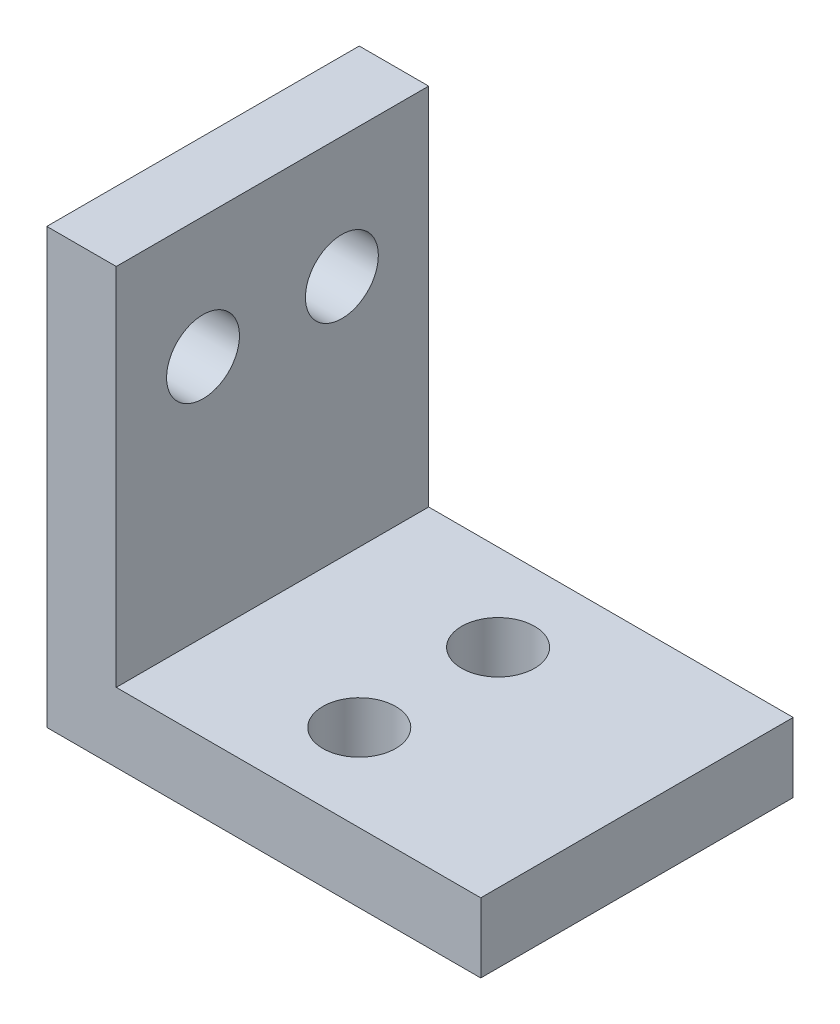
ISO-10303-21;
HEADER;
FILE_DESCRIPTION(('STEP AP214'),'2;1');
FILE_NAME('part.step','',(''),(''),'','','');
FILE_SCHEMA(('AUTOMOTIVE_DESIGN { 1 0 10303 214 1 1 1 1 }'));
ENDSEC;
DATA;
#1=APPLICATION_CONTEXT('core data for automotive mechanical design processes');
#2=APPLICATION_PROTOCOL_DEFINITION('international standard','automotive_design',2000,#1);
#3=PRODUCT_CONTEXT('',#1,'mechanical');
#4=PRODUCT('Part','Part','',(#3));
#5=PRODUCT_RELATED_PRODUCT_CATEGORY('part','',(#4));
#6=PRODUCT_DEFINITION_FORMATION('','',#4);
#7=PRODUCT_DEFINITION_CONTEXT('part definition',#1,'design');
#8=PRODUCT_DEFINITION('design','',#6,#7);
#9=PRODUCT_DEFINITION_SHAPE('','',#8);
#10=(LENGTH_UNIT() NAMED_UNIT(*) SI_UNIT(.MILLI.,.METRE.));
#11=(NAMED_UNIT(*) PLANE_ANGLE_UNIT() SI_UNIT($,.RADIAN.));
#12=(NAMED_UNIT(*) SI_UNIT($,.STERADIAN.) SOLID_ANGLE_UNIT());
#13=UNCERTAINTY_MEASURE_WITH_UNIT(LENGTH_MEASURE(1.E-05),#10,'distance_accuracy_value','');
#14=(GEOMETRIC_REPRESENTATION_CONTEXT(3) GLOBAL_UNCERTAINTY_ASSIGNED_CONTEXT((#13)) GLOBAL_UNIT_ASSIGNED_CONTEXT((#10,
#11,#12)) REPRESENTATION_CONTEXT('',''));
#15=CARTESIAN_POINT('',(0.,0.,0.));
#16=DIRECTION('',(0.,0.,1.));
#17=DIRECTION('',(1.,0.,0.));
#18=AXIS2_PLACEMENT_3D('',#15,#16,#17);
#19=CARTESIAN_POINT('',(4.,25.,18.));
#20=DIRECTION('',(0.,-1.,0.));
#21=DIRECTION('',(0.,0.,-1.));
#22=AXIS2_PLACEMENT_3D('',#19,#20,#21);
#23=PLANE('',#22);
#24=DIRECTION('',(-1.,0.,0.));
#25=VECTOR('',#24,1.);
#26=CARTESIAN_POINT('',(4.,25.,0.));
#27=LINE('',#26,#25);
#28=CARTESIAN_POINT('',(4.,25.,0.));
#29=VERTEX_POINT('',#28);
#30=CARTESIAN_POINT('',(0.,25.,0.));
#31=VERTEX_POINT('',#30);
#32=EDGE_CURVE('E119',#29,#31,#27,.T.);
#33=ORIENTED_EDGE('',*,*,#32,.T.);
#34=DIRECTION('',(0.,0.,-1.));
#35=VECTOR('',#34,1.);
#36=CARTESIAN_POINT('',(0.,25.,18.));
#37=LINE('',#36,#35);
#38=CARTESIAN_POINT('',(0.,25.,18.));
#39=VERTEX_POINT('',#38);
#40=EDGE_CURVE('E11',#39,#31,#37,.T.);
#41=ORIENTED_EDGE('',*,*,#40,.F.);
#42=DIRECTION('',(-1.,0.,0.));
#43=VECTOR('',#42,1.);
#44=CARTESIAN_POINT('',(4.,25.,18.));
#45=LINE('',#44,#43);
#46=CARTESIAN_POINT('',(4.,25.,18.));
#47=VERTEX_POINT('',#46);
#48=EDGE_CURVE('E130',#47,#39,#45,.T.);
#49=ORIENTED_EDGE('',*,*,#48,.F.);
#50=DIRECTION('',(0.,0.,-1.));
#51=VECTOR('',#50,1.);
#52=CARTESIAN_POINT('',(4.,25.,18.));
#53=LINE('',#52,#51);
#54=EDGE_CURVE('E115',#47,#29,#53,.T.);
#55=ORIENTED_EDGE('',*,*,#54,.T.);
#56=EDGE_LOOP('',(#33,#41,#49,#55));
#57=FACE_BOUND('',#56,.T.);
#58=ADVANCED_FACE('F33',(#57),#23,.F.);
#59=CARTESIAN_POINT('',(0.,25.,18.));
#60=DIRECTION('',(1.,0.,0.));
#61=DIRECTION('',(0.,1.,0.));
#62=AXIS2_PLACEMENT_3D('',#59,#60,#61);
#63=PLANE('',#62);
#64=CARTESIAN_POINT('',(0.,18.,13.));
#65=DIRECTION('',(-1.,0.,0.));
#66=DIRECTION('',(0.,-1.,0.));
#67=AXIS2_PLACEMENT_3D('',#64,#65,#66);
#68=CIRCLE('',#67,2.1);
#69=CARTESIAN_POINT('',(0.,15.9,13.));
#70=VERTEX_POINT('',#69);
#71=EDGE_CURVE('E137',#70,#70,#68,.T.);
#72=ORIENTED_EDGE('',*,*,#71,.F.);
#73=EDGE_LOOP('',(#72));
#74=FACE_BOUND('',#73,.T.);
#75=CARTESIAN_POINT('',(0.,18.,5.));
#76=DIRECTION('',(-1.,0.,0.));
#77=DIRECTION('',(0.,-1.,0.));
#78=AXIS2_PLACEMENT_3D('',#75,#76,#77);
#79=CIRCLE('',#78,2.1);
#80=CARTESIAN_POINT('',(0.,15.9,5.));
#81=VERTEX_POINT('',#80);
#82=EDGE_CURVE('E143',#81,#81,#79,.T.);
#83=ORIENTED_EDGE('',*,*,#82,.F.);
#84=EDGE_LOOP('',(#83));
#85=FACE_BOUND('',#84,.T.);
#86=DIRECTION('',(0.,-1.,0.));
#87=VECTOR('',#86,1.);
#88=CARTESIAN_POINT('',(0.,25.,0.));
#89=LINE('',#88,#87);
#90=CARTESIAN_POINT('',(0.,0.,0.));
#91=VERTEX_POINT('',#90);
#92=EDGE_CURVE('E122',#31,#91,#89,.T.);
#93=ORIENTED_EDGE('',*,*,#92,.T.);
#94=DIRECTION('',(0.,0.,-1.));
#95=VECTOR('',#94,1.);
#96=CARTESIAN_POINT('',(0.,0.,18.));
#97=LINE('',#96,#95);
#98=CARTESIAN_POINT('',(0.,0.,18.));
#99=VERTEX_POINT('',#98);
#100=EDGE_CURVE('E42',#99,#91,#97,.T.);
#101=ORIENTED_EDGE('',*,*,#100,.F.);
#102=DIRECTION('',(0.,-1.,0.));
#103=VECTOR('',#102,1.);
#104=CARTESIAN_POINT('',(0.,25.,18.));
#105=LINE('',#104,#103);
#106=EDGE_CURVE('E88',#39,#99,#105,.T.);
#107=ORIENTED_EDGE('',*,*,#106,.F.);
#108=ORIENTED_EDGE('',*,*,#40,.T.);
#109=EDGE_LOOP('',(#93,#101,#107,#108));
#110=FACE_BOUND('',#109,.T.);
#111=ADVANCED_FACE('F163',(#74,#85,#110),#63,.F.);
#112=CARTESIAN_POINT('',(0.,0.,18.));
#113=DIRECTION('',(0.,1.,0.));
#114=DIRECTION('',(0.,0.,1.));
#115=AXIS2_PLACEMENT_3D('',#112,#113,#114);
#116=PLANE('',#115);
#117=CARTESIAN_POINT('',(13.,0.,5.));
#118=DIRECTION('',(0.,1.,0.));
#119=DIRECTION('',(0.,0.,1.));
#120=AXIS2_PLACEMENT_3D('',#117,#118,#119);
#121=CIRCLE('',#120,2.1);
#122=CARTESIAN_POINT('',(13.,0.,7.1));
#123=VERTEX_POINT('',#122);
#124=EDGE_CURVE('E123',#123,#123,#121,.T.);
#125=ORIENTED_EDGE('',*,*,#124,.T.);
#126=EDGE_LOOP('',(#125));
#127=FACE_BOUND('',#126,.T.);
#128=CARTESIAN_POINT('',(13.,0.,13.));
#129=DIRECTION('',(0.,1.,0.));
#130=DIRECTION('',(0.,0.,1.));
#131=AXIS2_PLACEMENT_3D('',#128,#129,#130);
#132=CIRCLE('',#131,2.1);
#133=CARTESIAN_POINT('',(13.,0.,15.1));
#134=VERTEX_POINT('',#133);
#135=EDGE_CURVE('E153',#134,#134,#132,.T.);
#136=ORIENTED_EDGE('',*,*,#135,.T.);
#137=EDGE_LOOP('',(#136));
#138=FACE_BOUND('',#137,.T.);
#139=DIRECTION('',(1.,0.,0.));
#140=VECTOR('',#139,1.);
#141=CARTESIAN_POINT('',(0.,0.,0.));
#142=LINE('',#141,#140);
#143=CARTESIAN_POINT('',(25.,0.,0.));
#144=VERTEX_POINT('',#143);
#145=EDGE_CURVE('E125',#91,#144,#142,.T.);
#146=ORIENTED_EDGE('',*,*,#145,.T.);
#147=DIRECTION('',(0.,0.,-1.));
#148=VECTOR('',#147,1.);
#149=CARTESIAN_POINT('',(25.,0.,18.));
#150=LINE('',#149,#148);
#151=CARTESIAN_POINT('',(25.,0.,18.));
#152=VERTEX_POINT('',#151);
#153=EDGE_CURVE('E110',#152,#144,#150,.T.);
#154=ORIENTED_EDGE('',*,*,#153,.F.);
#155=DIRECTION('',(1.,0.,0.));
#156=VECTOR('',#155,1.);
#157=CARTESIAN_POINT('',(0.,0.,18.));
#158=LINE('',#157,#156);
#159=EDGE_CURVE('E101',#99,#152,#158,.T.);
#160=ORIENTED_EDGE('',*,*,#159,.F.);
#161=ORIENTED_EDGE('',*,*,#100,.T.);
#162=EDGE_LOOP('',(#146,#154,#160,#161));
#163=FACE_BOUND('',#162,.T.);
#164=ADVANCED_FACE('F166',(#127,#138,#163),#116,.F.);
#165=CARTESIAN_POINT('',(25.,0.,18.));
#166=DIRECTION('',(-1.,0.,0.));
#167=DIRECTION('',(0.,0.,1.));
#168=AXIS2_PLACEMENT_3D('',#165,#166,#167);
#169=PLANE('',#168);
#170=DIRECTION('',(0.,1.,0.));
#171=VECTOR('',#170,1.);
#172=CARTESIAN_POINT('',(25.,0.,0.));
#173=LINE('',#172,#171);
#174=CARTESIAN_POINT('',(25.,4.,0.));
#175=VERTEX_POINT('',#174);
#176=EDGE_CURVE('E109',#144,#175,#173,.T.);
#177=ORIENTED_EDGE('',*,*,#176,.T.);
#178=DIRECTION('',(0.,0.,-1.));
#179=VECTOR('',#178,1.);
#180=CARTESIAN_POINT('',(25.,4.,18.));
#181=LINE('',#180,#179);
#182=CARTESIAN_POINT('',(25.,4.,18.));
#183=VERTEX_POINT('',#182);
#184=EDGE_CURVE('E106',#183,#175,#181,.T.);
#185=ORIENTED_EDGE('',*,*,#184,.F.);
#186=DIRECTION('',(0.,1.,0.));
#187=VECTOR('',#186,1.);
#188=CARTESIAN_POINT('',(25.,0.,18.));
#189=LINE('',#188,#187);
#190=EDGE_CURVE('E95',#152,#183,#189,.T.);
#191=ORIENTED_EDGE('',*,*,#190,.F.);
#192=ORIENTED_EDGE('',*,*,#153,.T.);
#193=EDGE_LOOP('',(#177,#185,#191,#192));
#194=FACE_BOUND('',#193,.T.);
#195=ADVANCED_FACE('F107',(#194),#169,.F.);
#196=CARTESIAN_POINT('',(25.,4.,18.));
#197=DIRECTION('',(0.,-1.,0.));
#198=DIRECTION('',(1.,0.,0.));
#199=AXIS2_PLACEMENT_3D('',#196,#197,#198);
#200=PLANE('',#199);
#201=CARTESIAN_POINT('',(13.,4.,5.));
#202=DIRECTION('',(0.,1.,0.));
#203=DIRECTION('',(-1.,0.,0.));
#204=AXIS2_PLACEMENT_3D('',#201,#202,#203);
#205=CIRCLE('',#204,2.1);
#206=CARTESIAN_POINT('',(10.9,4.,5.));
#207=VERTEX_POINT('',#206);
#208=EDGE_CURVE('E150',#207,#207,#205,.T.);
#209=ORIENTED_EDGE('',*,*,#208,.F.);
#210=EDGE_LOOP('',(#209));
#211=FACE_BOUND('',#210,.T.);
#212=CARTESIAN_POINT('',(13.,4.,13.));
#213=DIRECTION('',(0.,1.,0.));
#214=DIRECTION('',(-1.,0.,0.));
#215=AXIS2_PLACEMENT_3D('',#212,#213,#214);
#216=CIRCLE('',#215,2.1);
#217=CARTESIAN_POINT('',(10.9,4.,13.));
#218=VERTEX_POINT('',#217);
#219=EDGE_CURVE('E141',#218,#218,#216,.T.);
#220=ORIENTED_EDGE('',*,*,#219,.F.);
#221=EDGE_LOOP('',(#220));
#222=FACE_BOUND('',#221,.T.);
#223=DIRECTION('',(-1.,0.,0.));
#224=VECTOR('',#223,1.);
#225=CARTESIAN_POINT('',(25.,4.,0.));
#226=LINE('',#225,#224);
#227=CARTESIAN_POINT('',(4.,4.,0.));
#228=VERTEX_POINT('',#227);
#229=EDGE_CURVE('E74',#175,#228,#226,.T.);
#230=ORIENTED_EDGE('',*,*,#229,.T.);
#231=DIRECTION('',(0.,0.,-1.));
#232=VECTOR('',#231,1.);
#233=CARTESIAN_POINT('',(4.,4.,18.));
#234=LINE('',#233,#232);
#235=CARTESIAN_POINT('',(4.,4.,18.));
#236=VERTEX_POINT('',#235);
#237=EDGE_CURVE('E111',#236,#228,#234,.T.);
#238=ORIENTED_EDGE('',*,*,#237,.F.);
#239=DIRECTION('',(-1.,0.,0.));
#240=VECTOR('',#239,1.);
#241=CARTESIAN_POINT('',(25.,4.,18.));
#242=LINE('',#241,#240);
#243=EDGE_CURVE('E99',#183,#236,#242,.T.);
#244=ORIENTED_EDGE('',*,*,#243,.F.);
#245=ORIENTED_EDGE('',*,*,#184,.T.);
#246=EDGE_LOOP('',(#230,#238,#244,#245));
#247=FACE_BOUND('',#246,.T.);
#248=ADVANCED_FACE('F113',(#211,#222,#247),#200,.F.);
#249=CARTESIAN_POINT('',(4.,4.,18.));
#250=DIRECTION('',(-1.,0.,0.));
#251=DIRECTION('',(0.,-1.,0.));
#252=AXIS2_PLACEMENT_3D('',#249,#250,#251);
#253=PLANE('',#252);
#254=CARTESIAN_POINT('',(4.,18.,13.));
#255=DIRECTION('',(-1.,0.,0.));
#256=DIRECTION('',(0.,-1.,0.));
#257=AXIS2_PLACEMENT_3D('',#254,#255,#256);
#258=CIRCLE('',#257,2.1);
#259=CARTESIAN_POINT('',(4.,15.9,13.));
#260=VERTEX_POINT('',#259);
#261=EDGE_CURVE('E36',#260,#260,#258,.T.);
#262=ORIENTED_EDGE('',*,*,#261,.T.);
#263=EDGE_LOOP('',(#262));
#264=FACE_BOUND('',#263,.T.);
#265=CARTESIAN_POINT('',(4.,18.,5.));
#266=DIRECTION('',(-1.,0.,0.));
#267=DIRECTION('',(0.,-1.,0.));
#268=AXIS2_PLACEMENT_3D('',#265,#266,#267);
#269=CIRCLE('',#268,2.1);
#270=CARTESIAN_POINT('',(4.,15.9,5.));
#271=VERTEX_POINT('',#270);
#272=EDGE_CURVE('E135',#271,#271,#269,.T.);
#273=ORIENTED_EDGE('',*,*,#272,.T.);
#274=EDGE_LOOP('',(#273));
#275=FACE_BOUND('',#274,.T.);
#276=DIRECTION('',(0.,1.,0.));
#277=VECTOR('',#276,1.);
#278=CARTESIAN_POINT('',(4.,4.,0.));
#279=LINE('',#278,#277);
#280=EDGE_CURVE('E80',#228,#29,#279,.T.);
#281=ORIENTED_EDGE('',*,*,#280,.T.);
#282=ORIENTED_EDGE('',*,*,#54,.F.);
#283=DIRECTION('',(0.,1.,0.));
#284=VECTOR('',#283,1.);
#285=CARTESIAN_POINT('',(4.,4.,18.));
#286=LINE('',#285,#284);
#287=EDGE_CURVE('E51',#236,#47,#286,.T.);
#288=ORIENTED_EDGE('',*,*,#287,.F.);
#289=ORIENTED_EDGE('',*,*,#237,.T.);
#290=EDGE_LOOP('',(#281,#282,#288,#289));
#291=FACE_BOUND('',#290,.T.);
#292=ADVANCED_FACE('F171',(#264,#275,#291),#253,.F.);
#293=CARTESIAN_POINT('',(0.,0.,18.));
#294=DIRECTION('',(0.,0.,1.));
#295=DIRECTION('',(1.,0.,0.));
#296=AXIS2_PLACEMENT_3D('',#293,#294,#295);
#297=PLANE('',#296);
#298=ORIENTED_EDGE('',*,*,#48,.T.);
#299=ORIENTED_EDGE('',*,*,#106,.T.);
#300=ORIENTED_EDGE('',*,*,#159,.T.);
#301=ORIENTED_EDGE('',*,*,#190,.T.);
#302=ORIENTED_EDGE('',*,*,#243,.T.);
#303=ORIENTED_EDGE('',*,*,#287,.T.);
#304=EDGE_LOOP('',(#298,#299,#300,#301,#302,#303));
#305=FACE_BOUND('',#304,.T.);
#306=ADVANCED_FACE('F97',(#305),#297,.T.);
#307=CARTESIAN_POINT('',(0.,0.,0.));
#308=DIRECTION('',(0.,0.,1.));
#309=DIRECTION('',(1.,0.,0.));
#310=AXIS2_PLACEMENT_3D('',#307,#308,#309);
#311=PLANE('',#310);
#312=ORIENTED_EDGE('',*,*,#32,.F.);
#313=ORIENTED_EDGE('',*,*,#280,.F.);
#314=ORIENTED_EDGE('',*,*,#229,.F.);
#315=ORIENTED_EDGE('',*,*,#176,.F.);
#316=ORIENTED_EDGE('',*,*,#145,.F.);
#317=ORIENTED_EDGE('',*,*,#92,.F.);
#318=EDGE_LOOP('',(#312,#313,#314,#315,#316,#317));
#319=FACE_BOUND('',#318,.T.);
#320=ADVANCED_FACE('F169',(#319),#311,.F.);
#321=CARTESIAN_POINT('',(13.,-34.,13.));
#322=DIRECTION('',(0.,1.,0.));
#323=DIRECTION('',(-1.,0.,0.));
#324=AXIS2_PLACEMENT_3D('',#321,#322,#323);
#325=CYLINDRICAL_SURFACE('',#324,2.1);
#326=ORIENTED_EDGE('',*,*,#219,.T.);
#327=EDGE_LOOP('',(#326));
#328=FACE_BOUND('',#327,.T.);
#329=ORIENTED_EDGE('',*,*,#135,.F.);
#330=EDGE_LOOP('',(#329));
#331=FACE_BOUND('',#330,.T.);
#332=ADVANCED_FACE('F214',(#328,#331),#325,.F.);
#333=CARTESIAN_POINT('',(13.,-34.,5.));
#334=DIRECTION('',(0.,1.,0.));
#335=DIRECTION('',(-1.,0.,0.));
#336=AXIS2_PLACEMENT_3D('',#333,#334,#335);
#337=CYLINDRICAL_SURFACE('',#336,2.1);
#338=ORIENTED_EDGE('',*,*,#208,.T.);
#339=EDGE_LOOP('',(#338));
#340=FACE_BOUND('',#339,.T.);
#341=ORIENTED_EDGE('',*,*,#124,.F.);
#342=EDGE_LOOP('',(#341));
#343=FACE_BOUND('',#342,.T.);
#344=ADVANCED_FACE('F219',(#340,#343),#337,.F.);
#345=CARTESIAN_POINT('',(38.,18.,5.));
#346=DIRECTION('',(-1.,0.,0.));
#347=DIRECTION('',(0.,-1.,0.));
#348=AXIS2_PLACEMENT_3D('',#345,#346,#347);
#349=CYLINDRICAL_SURFACE('',#348,2.1);
#350=ORIENTED_EDGE('',*,*,#82,.T.);
#351=EDGE_LOOP('',(#350));
#352=FACE_BOUND('',#351,.T.);
#353=ORIENTED_EDGE('',*,*,#272,.F.);
#354=EDGE_LOOP('',(#353));
#355=FACE_BOUND('',#354,.T.);
#356=ADVANCED_FACE('F230',(#352,#355),#349,.F.);
#357=CARTESIAN_POINT('',(38.,18.,13.));
#358=DIRECTION('',(-1.,0.,0.));
#359=DIRECTION('',(0.,-1.,0.));
#360=AXIS2_PLACEMENT_3D('',#357,#358,#359);
#361=CYLINDRICAL_SURFACE('',#360,2.1);
#362=ORIENTED_EDGE('',*,*,#71,.T.);
#363=EDGE_LOOP('',(#362));
#364=FACE_BOUND('',#363,.T.);
#365=ORIENTED_EDGE('',*,*,#261,.F.);
#366=EDGE_LOOP('',(#365));
#367=FACE_BOUND('',#366,.T.);
#368=ADVANCED_FACE('F250',(#364,#367),#361,.F.);
#369=CLOSED_SHELL('',(#58,#111,#164,#195,#248,#292,#306,#320,#332,#344,#356,#368));
#370=MANIFOLD_SOLID_BREP('B2',#369);
#371=ADVANCED_BREP_SHAPE_REPRESENTATION('',(#18,#370),#14);
#372=SHAPE_DEFINITION_REPRESENTATION(#9,#371);
ENDSEC;
END-ISO-10303-21;
